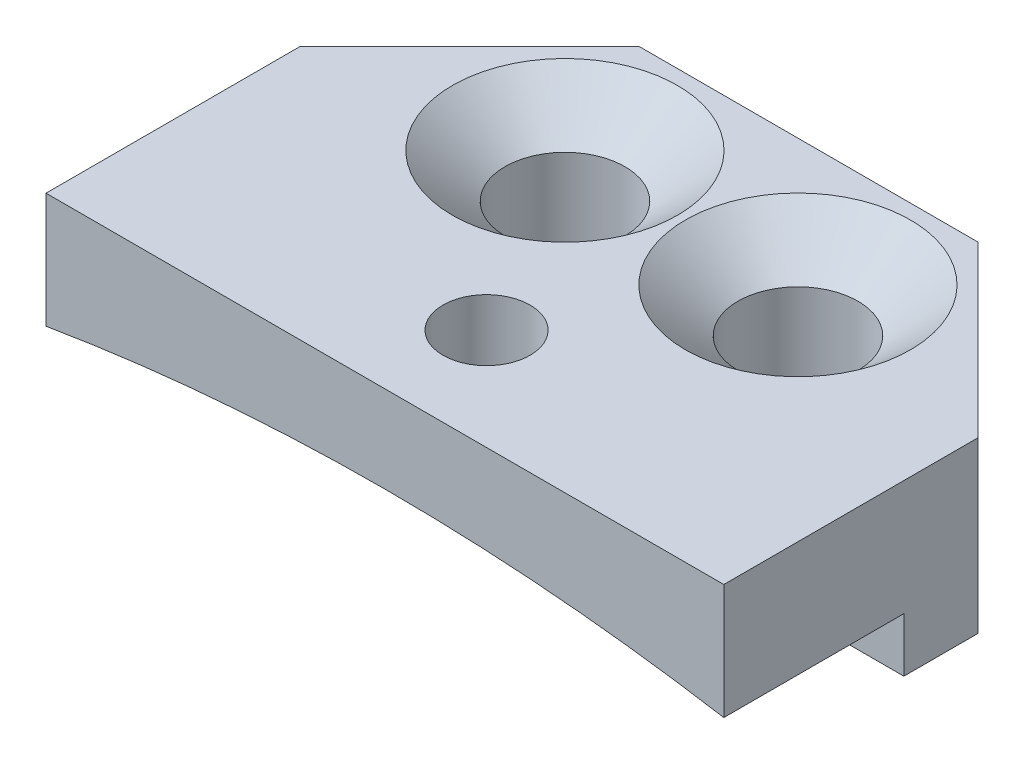
ISO-10303-21;
HEADER;
FILE_DESCRIPTION(('STEP AP214'),'2;1');
FILE_NAME('part.step','',(''),(''),'','','');
FILE_SCHEMA(('AUTOMOTIVE_DESIGN { 1 0 10303 214 1 1 1 1 }'));
ENDSEC;
DATA;
#1=APPLICATION_CONTEXT('core data for automotive mechanical design processes');
#2=APPLICATION_PROTOCOL_DEFINITION('international standard','automotive_design',2000,#1);
#3=PRODUCT_CONTEXT('',#1,'mechanical');
#4=PRODUCT('Part','Part','',(#3));
#5=PRODUCT_RELATED_PRODUCT_CATEGORY('part','',(#4));
#6=PRODUCT_DEFINITION_FORMATION('','',#4);
#7=PRODUCT_DEFINITION_CONTEXT('part definition',#1,'design');
#8=PRODUCT_DEFINITION('design','',#6,#7);
#9=PRODUCT_DEFINITION_SHAPE('','',#8);
#10=(LENGTH_UNIT() NAMED_UNIT(*) SI_UNIT(.MILLI.,.METRE.));
#11=(NAMED_UNIT(*) PLANE_ANGLE_UNIT() SI_UNIT($,.RADIAN.));
#12=(NAMED_UNIT(*) SI_UNIT($,.STERADIAN.) SOLID_ANGLE_UNIT());
#13=UNCERTAINTY_MEASURE_WITH_UNIT(LENGTH_MEASURE(1.E-05),#10,'distance_accuracy_value','');
#14=(GEOMETRIC_REPRESENTATION_CONTEXT(3) GLOBAL_UNCERTAINTY_ASSIGNED_CONTEXT((#13)) GLOBAL_UNIT_ASSIGNED_CONTEXT((#10,
#11,#12)) REPRESENTATION_CONTEXT('',''));
#15=CARTESIAN_POINT('',(0.,0.,0.));
#16=DIRECTION('',(0.,0.,1.));
#17=DIRECTION('',(1.,0.,0.));
#18=AXIS2_PLACEMENT_3D('',#15,#16,#17);
#19=CARTESIAN_POINT('',(-12.7,6.35,-7.9375));
#20=DIRECTION('',(1.,0.,0.));
#21=DIRECTION('',(0.,0.,-1.));
#22=AXIS2_PLACEMENT_3D('',#19,#20,#21);
#23=PLANE('',#22);
#24=DIRECTION('',(0.,-1.,0.));
#25=VECTOR('',#24,1.);
#26=CARTESIAN_POINT('',(-12.7,2.03069610250052,1.190625));
#27=LINE('',#26,#25);
#28=CARTESIAN_POINT('',(-12.7,2.03069610250052,1.190625));
#29=VERTEX_POINT('',#28);
#30=CARTESIAN_POINT('',(-12.7,0.,1.190625));
#31=VERTEX_POINT('',#30);
#32=EDGE_CURVE('E53',#29,#31,#27,.T.);
#33=ORIENTED_EDGE('',*,*,#32,.F.);
#34=DIRECTION('',(0.,0.,1.));
#35=VECTOR('',#34,1.);
#36=CARTESIAN_POINT('',(-12.7,2.03069610250052,1.190625));
#37=LINE('',#36,#35);
#38=CARTESIAN_POINT('',(-12.7,2.03069610250052,7.9375));
#39=VERTEX_POINT('',#38);
#40=EDGE_CURVE('E104',#29,#39,#37,.T.);
#41=ORIENTED_EDGE('',*,*,#40,.T.);
#42=DIRECTION('',(0.,-1.,0.));
#43=VECTOR('',#42,1.);
#44=CARTESIAN_POINT('',(-12.7,6.35,7.9375));
#45=LINE('',#44,#43);
#46=CARTESIAN_POINT('',(-12.7,6.35,7.9375));
#47=VERTEX_POINT('',#46);
#48=EDGE_CURVE('E149',#47,#39,#45,.T.);
#49=ORIENTED_EDGE('',*,*,#48,.F.);
#50=DIRECTION('',(0.,0.,1.));
#51=VECTOR('',#50,1.);
#52=CARTESIAN_POINT('',(-12.7,6.35,-7.9375));
#53=LINE('',#52,#51);
#54=CARTESIAN_POINT('',(-12.7,6.35,-1.5875));
#55=VERTEX_POINT('',#54);
#56=EDGE_CURVE('E131',#55,#47,#53,.T.);
#57=ORIENTED_EDGE('',*,*,#56,.F.);
#58=DIRECTION('',(0.,-1.,0.));
#59=VECTOR('',#58,1.);
#60=CARTESIAN_POINT('',(-12.7,6.35,-1.5875));
#61=LINE('',#60,#59);
#62=CARTESIAN_POINT('',(-12.7,0.,-1.5875));
#63=VERTEX_POINT('',#62);
#64=EDGE_CURVE('E11',#55,#63,#61,.T.);
#65=ORIENTED_EDGE('',*,*,#64,.T.);
#66=DIRECTION('',(0.,0.,1.));
#67=VECTOR('',#66,1.);
#68=CARTESIAN_POINT('',(-12.7,0.,-7.9375));
#69=LINE('',#68,#67);
#70=EDGE_CURVE('E122',#63,#31,#69,.T.);
#71=ORIENTED_EDGE('',*,*,#70,.T.);
#72=EDGE_LOOP('',(#33,#41,#49,#57,#65,#71));
#73=FACE_BOUND('',#72,.T.);
#74=ADVANCED_FACE('F33',(#73),#23,.F.);
#75=CARTESIAN_POINT('',(-12.7,6.35,7.9375));
#76=DIRECTION('',(0.,0.,-1.));
#77=DIRECTION('',(-1.,0.,0.));
#78=AXIS2_PLACEMENT_3D('',#75,#76,#77);
#79=PLANE('',#78);
#80=ORIENTED_EDGE('',*,*,#48,.T.);
#81=CARTESIAN_POINT('',(0.,-73.1035171428646,7.9375));
#82=DIRECTION('',(0.,0.,1.));
#83=DIRECTION('',(-1.,0.,0.));
#84=AXIS2_PLACEMENT_3D('',#81,#82,#83);
#85=CIRCLE('',#84,76.2);
#86=CARTESIAN_POINT('',(12.7,2.03069610250052,7.9375));
#87=VERTEX_POINT('',#86);
#88=EDGE_CURVE('E109',#87,#39,#85,.T.);
#89=ORIENTED_EDGE('',*,*,#88,.F.);
#90=DIRECTION('',(0.,-1.,0.));
#91=VECTOR('',#90,1.);
#92=CARTESIAN_POINT('',(12.7,6.35,7.9375));
#93=LINE('',#92,#91);
#94=CARTESIAN_POINT('',(12.7,6.35,7.9375));
#95=VERTEX_POINT('',#94);
#96=EDGE_CURVE('E141',#95,#87,#93,.T.);
#97=ORIENTED_EDGE('',*,*,#96,.F.);
#98=DIRECTION('',(1.,0.,0.));
#99=VECTOR('',#98,1.);
#100=CARTESIAN_POINT('',(-12.7,6.35,7.9375));
#101=LINE('',#100,#99);
#102=EDGE_CURVE('E133',#47,#95,#101,.T.);
#103=ORIENTED_EDGE('',*,*,#102,.F.);
#104=EDGE_LOOP('',(#80,#89,#97,#103));
#105=FACE_BOUND('',#104,.T.);
#106=ADVANCED_FACE('F185',(#105),#79,.F.);
#107=CARTESIAN_POINT('',(12.7,6.35,-7.9375));
#108=DIRECTION('',(-1.,0.,0.));
#109=DIRECTION('',(0.,0.,1.));
#110=AXIS2_PLACEMENT_3D('',#107,#108,#109);
#111=PLANE('',#110);
#112=ORIENTED_EDGE('',*,*,#96,.T.);
#113=DIRECTION('',(0.,0.,1.));
#114=VECTOR('',#113,1.);
#115=CARTESIAN_POINT('',(12.7,2.03069610250052,1.190625));
#116=LINE('',#115,#114);
#117=CARTESIAN_POINT('',(12.7,2.03069610250052,1.190625));
#118=VERTEX_POINT('',#117);
#119=EDGE_CURVE('E113',#118,#87,#116,.T.);
#120=ORIENTED_EDGE('',*,*,#119,.F.);
#121=DIRECTION('',(0.,1.,0.));
#122=VECTOR('',#121,1.);
#123=CARTESIAN_POINT('',(12.7,0.,1.190625));
#124=LINE('',#123,#122);
#125=CARTESIAN_POINT('',(12.7,0.,1.190625));
#126=VERTEX_POINT('',#125);
#127=EDGE_CURVE('E114',#126,#118,#124,.T.);
#128=ORIENTED_EDGE('',*,*,#127,.F.);
#129=DIRECTION('',(0.,0.,-1.));
#130=VECTOR('',#129,1.);
#131=CARTESIAN_POINT('',(12.7,0.,-7.9375));
#132=LINE('',#131,#130);
#133=CARTESIAN_POINT('',(12.7,0.,-1.58749999999997));
#134=VERTEX_POINT('',#133);
#135=EDGE_CURVE('E143',#126,#134,#132,.T.);
#136=ORIENTED_EDGE('',*,*,#135,.T.);
#137=DIRECTION('',(0.,1.,0.));
#138=VECTOR('',#137,1.);
#139=CARTESIAN_POINT('',(12.7,6.35,-1.58749999999997));
#140=LINE('',#139,#138);
#141=CARTESIAN_POINT('',(12.7,6.35,-1.58749999999997));
#142=VERTEX_POINT('',#141);
#143=EDGE_CURVE('E161',#134,#142,#140,.T.);
#144=ORIENTED_EDGE('',*,*,#143,.T.);
#145=DIRECTION('',(0.,0.,-1.));
#146=VECTOR('',#145,1.);
#147=CARTESIAN_POINT('',(12.7,6.35,-7.9375));
#148=LINE('',#147,#146);
#149=EDGE_CURVE('E136',#95,#142,#148,.T.);
#150=ORIENTED_EDGE('',*,*,#149,.F.);
#151=EDGE_LOOP('',(#112,#120,#128,#136,#144,#150));
#152=FACE_BOUND('',#151,.T.);
#153=ADVANCED_FACE('F182',(#152),#111,.F.);
#154=CARTESIAN_POINT('',(-12.7,6.35,-7.9375));
#155=DIRECTION('',(0.,0.,1.));
#156=DIRECTION('',(1.,0.,0.));
#157=AXIS2_PLACEMENT_3D('',#154,#155,#156);
#158=PLANE('',#157);
#159=DIRECTION('',(-1.,0.,0.));
#160=VECTOR('',#159,1.);
#161=CARTESIAN_POINT('',(-12.7,6.35,-7.9375));
#162=LINE('',#161,#160);
#163=CARTESIAN_POINT('',(6.34999999999999,6.35,-7.9375));
#164=VERTEX_POINT('',#163);
#165=CARTESIAN_POINT('',(-6.34999999999998,6.35,-7.9375));
#166=VERTEX_POINT('',#165);
#167=EDGE_CURVE('E139',#164,#166,#162,.T.);
#168=ORIENTED_EDGE('',*,*,#167,.F.);
#169=DIRECTION('',(0.,-1.,0.));
#170=VECTOR('',#169,1.);
#171=CARTESIAN_POINT('',(6.34999999999999,6.35,-7.9375));
#172=LINE('',#171,#170);
#173=CARTESIAN_POINT('',(6.34999999999999,0.,-7.9375));
#174=VERTEX_POINT('',#173);
#175=EDGE_CURVE('E153',#164,#174,#172,.T.);
#176=ORIENTED_EDGE('',*,*,#175,.T.);
#177=DIRECTION('',(-1.,0.,0.));
#178=VECTOR('',#177,1.);
#179=CARTESIAN_POINT('',(-12.7,0.,-7.9375));
#180=LINE('',#179,#178);
#181=CARTESIAN_POINT('',(-6.34999999999998,0.,-7.9375));
#182=VERTEX_POINT('',#181);
#183=EDGE_CURVE('E134',#174,#182,#180,.T.);
#184=ORIENTED_EDGE('',*,*,#183,.T.);
#185=DIRECTION('',(0.,1.,0.));
#186=VECTOR('',#185,1.);
#187=CARTESIAN_POINT('',(-6.34999999999998,6.35,-7.9375));
#188=LINE('',#187,#186);
#189=EDGE_CURVE('E151',#182,#166,#188,.T.);
#190=ORIENTED_EDGE('',*,*,#189,.T.);
#191=EDGE_LOOP('',(#168,#176,#184,#190));
#192=FACE_BOUND('',#191,.T.);
#193=ADVANCED_FACE('F172',(#192),#158,.F.);
#194=CARTESIAN_POINT('',(0.,6.35,0.));
#195=DIRECTION('',(0.,1.,0.));
#196=DIRECTION('',(0.,0.,1.));
#197=AXIS2_PLACEMENT_3D('',#194,#195,#196);
#198=PLANE('',#197);
#199=CARTESIAN_POINT('',(-4.365625,6.35,-3.175));
#200=DIRECTION('',(0.,1.,0.));
#201=DIRECTION('',(0.,0.,1.));
#202=AXIS2_PLACEMENT_3D('',#199,#200,#201);
#203=CIRCLE('',#202,4.2164);
#204=CARTESIAN_POINT('',(-4.365625,6.35,1.0414));
#205=VERTEX_POINT('',#204);
#206=EDGE_CURVE('E305',#205,#205,#203,.T.);
#207=ORIENTED_EDGE('',*,*,#206,.F.);
#208=EDGE_LOOP('',(#207));
#209=FACE_BOUND('',#208,.T.);
#210=CARTESIAN_POINT('',(4.365625,6.35,-3.175));
#211=DIRECTION('',(0.,1.,0.));
#212=DIRECTION('',(0.,0.,1.));
#213=AXIS2_PLACEMENT_3D('',#210,#211,#212);
#214=CIRCLE('',#213,4.2164);
#215=CARTESIAN_POINT('',(4.365625,6.35,1.0414));
#216=VERTEX_POINT('',#215);
#217=EDGE_CURVE('E297',#216,#216,#214,.T.);
#218=ORIENTED_EDGE('',*,*,#217,.F.);
#219=EDGE_LOOP('',(#218));
#220=FACE_BOUND('',#219,.T.);
#221=CARTESIAN_POINT('',(-1.45845508918381E-12,6.35,4.12928027816568));
#222=DIRECTION('',(0.,1.,0.));
#223=DIRECTION('',(0.,0.,1.));
#224=AXIS2_PLACEMENT_3D('',#221,#222,#223);
#225=CIRCLE('',#224,1.63194999998511);
#226=CARTESIAN_POINT('',(-1.45845508918381E-12,6.35,5.76123027815079));
#227=VERTEX_POINT('',#226);
#228=EDGE_CURVE('E287',#227,#227,#225,.T.);
#229=ORIENTED_EDGE('',*,*,#228,.F.);
#230=EDGE_LOOP('',(#229));
#231=FACE_BOUND('',#230,.T.);
#232=ORIENTED_EDGE('',*,*,#149,.T.);
#233=DIRECTION('',(0.707106781186547,0.,0.707106781186548));
#234=VECTOR('',#233,1.);
#235=CARTESIAN_POINT('',(7.14375,6.35,-7.14374999999998));
#236=LINE('',#235,#234);
#237=EDGE_CURVE('E46',#142,#164,#236,.F.);
#238=ORIENTED_EDGE('',*,*,#237,.T.);
#239=ORIENTED_EDGE('',*,*,#167,.T.);
#240=DIRECTION('',(0.707106781186549,0.,-0.707106781186546));
#241=VECTOR('',#240,1.);
#242=CARTESIAN_POINT('',(-7.14374999999998,6.35,-7.14375000000001));
#243=LINE('',#242,#241);
#244=EDGE_CURVE('E61',#166,#55,#243,.F.);
#245=ORIENTED_EDGE('',*,*,#244,.T.);
#246=ORIENTED_EDGE('',*,*,#56,.T.);
#247=ORIENTED_EDGE('',*,*,#102,.T.);
#248=EDGE_LOOP('',(#232,#238,#239,#245,#246,#247));
#249=FACE_BOUND('',#248,.T.);
#250=ADVANCED_FACE('F166',(#209,#220,#231,#249),#198,.T.);
#251=CARTESIAN_POINT('',(0.,0.,0.));
#252=DIRECTION('',(0.,1.,0.));
#253=DIRECTION('',(0.,0.,1.));
#254=AXIS2_PLACEMENT_3D('',#251,#252,#253);
#255=PLANE('',#254);
#256=CARTESIAN_POINT('',(-4.365625,0.,-3.175));
#257=DIRECTION('',(0.,1.,0.));
#258=DIRECTION('',(0.,0.,1.));
#259=AXIS2_PLACEMENT_3D('',#256,#257,#258);
#260=CIRCLE('',#259,2.2479);
#261=CARTESIAN_POINT('',(-4.365625,0.,-0.927100000000001));
#262=VERTEX_POINT('',#261);
#263=EDGE_CURVE('E300',#262,#262,#260,.T.);
#264=ORIENTED_EDGE('',*,*,#263,.T.);
#265=EDGE_LOOP('',(#264));
#266=FACE_BOUND('',#265,.T.);
#267=CARTESIAN_POINT('',(4.365625,0.,-3.175));
#268=DIRECTION('',(0.,1.,0.));
#269=DIRECTION('',(0.,0.,1.));
#270=AXIS2_PLACEMENT_3D('',#267,#268,#269);
#271=CIRCLE('',#270,2.2479);
#272=CARTESIAN_POINT('',(4.365625,0.,-0.927100000000001));
#273=VERTEX_POINT('',#272);
#274=EDGE_CURVE('E289',#273,#273,#271,.T.);
#275=ORIENTED_EDGE('',*,*,#274,.T.);
#276=EDGE_LOOP('',(#275));
#277=FACE_BOUND('',#276,.T.);
#278=ORIENTED_EDGE('',*,*,#135,.F.);
#279=DIRECTION('',(1.,0.,0.));
#280=VECTOR('',#279,1.);
#281=CARTESIAN_POINT('',(-12.7,0.,1.190625));
#282=LINE('',#281,#280);
#283=EDGE_CURVE('E123',#31,#126,#282,.T.);
#284=ORIENTED_EDGE('',*,*,#283,.F.);
#285=ORIENTED_EDGE('',*,*,#70,.F.);
#286=DIRECTION('',(-0.707106781186549,0.,0.707106781186546));
#287=VECTOR('',#286,1.);
#288=CARTESIAN_POINT('',(-12.7,0.,-1.5875));
#289=LINE('',#288,#287);
#290=EDGE_CURVE('E156',#63,#182,#289,.F.);
#291=ORIENTED_EDGE('',*,*,#290,.T.);
#292=ORIENTED_EDGE('',*,*,#183,.F.);
#293=DIRECTION('',(-0.707106781186547,0.,-0.707106781186548));
#294=VECTOR('',#293,1.);
#295=CARTESIAN_POINT('',(6.34999999999999,0.,-7.9375));
#296=LINE('',#295,#294);
#297=EDGE_CURVE('E158',#174,#134,#296,.F.);
#298=ORIENTED_EDGE('',*,*,#297,.T.);
#299=EDGE_LOOP('',(#278,#284,#285,#291,#292,#298));
#300=FACE_BOUND('',#299,.T.);
#301=ADVANCED_FACE('F178',(#266,#277,#300),#255,.F.);
#302=CARTESIAN_POINT('',(6.34999999999999,6.35,-7.9375));
#303=DIRECTION('',(-0.707106781186548,0.,0.707106781186547));
#304=DIRECTION('',(0.,-1.,0.));
#305=AXIS2_PLACEMENT_3D('',#302,#303,#304);
#306=PLANE('',#305);
#307=ORIENTED_EDGE('',*,*,#237,.F.);
#308=ORIENTED_EDGE('',*,*,#143,.F.);
#309=ORIENTED_EDGE('',*,*,#297,.F.);
#310=ORIENTED_EDGE('',*,*,#175,.F.);
#311=EDGE_LOOP('',(#307,#308,#309,#310));
#312=FACE_BOUND('',#311,.T.);
#313=ADVANCED_FACE('F175',(#312),#306,.F.);
#314=CARTESIAN_POINT('',(-12.7,6.35,-1.5875));
#315=DIRECTION('',(0.707106781186546,0.,0.707106781186549));
#316=DIRECTION('',(0.,-1.,0.));
#317=AXIS2_PLACEMENT_3D('',#314,#315,#316);
#318=PLANE('',#317);
#319=ORIENTED_EDGE('',*,*,#244,.F.);
#320=ORIENTED_EDGE('',*,*,#189,.F.);
#321=ORIENTED_EDGE('',*,*,#290,.F.);
#322=ORIENTED_EDGE('',*,*,#64,.F.);
#323=EDGE_LOOP('',(#319,#320,#321,#322));
#324=FACE_BOUND('',#323,.T.);
#325=ADVANCED_FACE('F35',(#324),#318,.F.);
#326=CARTESIAN_POINT('',(0.,-73.1035171428646,1.190625));
#327=DIRECTION('',(0.,0.,1.));
#328=DIRECTION('',(1.,0.,0.));
#329=AXIS2_PLACEMENT_3D('',#326,#327,#328);
#330=CYLINDRICAL_SURFACE('',#329,76.2);
#331=CARTESIAN_POINT('',(-1.45845508918381E-12,3.09648285713539,5.76123027815079));
#332=CARTESIAN_POINT('',(0.0916560718760625,3.0964826212527,5.76122621705502));
#333=CARTESIAN_POINT('',(0.183378335509574,3.09631571151644,5.75348277144416));
#334=CARTESIAN_POINT('',(0.36429601043271,3.09566592106379,5.72270051827388));
#335=CARTESIAN_POINT('',(0.453488258185255,3.09518266151056,5.69964337168951));
#336=CARTESIAN_POINT('',(0.626698727302549,3.09395490782087,5.63889109554065));
#337=CARTESIAN_POINT('',(0.710719427750643,3.09321054001647,5.60120304391026));
#338=CARTESIAN_POINT('',(0.871217731000541,3.09154456863522,5.51226872564322));
#339=CARTESIAN_POINT('',(0.947697185614447,3.09062300873407,5.4610257989513));
#340=CARTESIAN_POINT('',(1.09098892506416,3.08870613398489,5.3464172874719));
#341=CARTESIAN_POINT('',(1.15779880918722,3.08771080091325,5.28304870122322));
#342=CARTESIAN_POINT('',(1.2798349843189,3.0857587237207,5.14599214724925));
#343=CARTESIAN_POINT('',(1.33506081716483,3.0848019811273,5.07230377155648));
#344=CARTESIAN_POINT('',(1.43236218689421,3.08303492231967,4.91669404929379));
#345=CARTESIAN_POINT('',(1.47443670451439,3.08222461745682,4.8347720652464));
#346=CARTESIAN_POINT('',(1.54423429175574,3.08084192183114,4.66502522356817));
#347=CARTESIAN_POINT('',(1.57195740485299,3.08026953034758,4.57720038382031));
#348=CARTESIAN_POINT('',(1.61226122119566,3.07942730243276,4.39815508844711));
#349=CARTESIAN_POINT('',(1.62484424953912,3.07915741954499,4.30693515643282));
#350=CARTESIAN_POINT('',(1.63451785694038,3.07895049815825,4.12367733575581));
#351=CARTESIAN_POINT('',(1.63160848120144,3.07901345868813,4.03163944948048));
#352=CARTESIAN_POINT('',(1.61038187813256,3.07946508086334,3.84937412965198));
#353=CARTESIAN_POINT('',(1.5920671757049,3.07985368913562,3.75914640189846));
#354=CARTESIAN_POINT('',(1.54055370420173,3.08091271292653,3.58304652484292));
#355=CARTESIAN_POINT('',(1.50735491071379,3.08158312890738,3.49717438268507));
#356=CARTESIAN_POINT('',(1.42701276044862,3.08313024997841,3.3322152320564));
#357=CARTESIAN_POINT('',(1.37986824552161,3.08400697220046,3.25312878782117));
#358=CARTESIAN_POINT('',(1.27297380282234,3.08586784930659,3.10399224111826));
#359=CARTESIAN_POINT('',(1.21322386286893,3.08685200429448,3.03394214738289));
#360=CARTESIAN_POINT('',(1.08280035551403,3.08881703546746,2.90485204167673));
#361=CARTESIAN_POINT('',(1.01212459503144,3.0897979109538,2.84581424540645));
#362=CARTESIAN_POINT('',(0.861863437998916,3.09164561202882,2.74044167599766));
#363=CARTESIAN_POINT('',(0.782278040154495,3.09251243760093,2.69410690470477));
#364=CARTESIAN_POINT('',(0.616455569661828,3.09403432353906,2.61545594078182));
#365=CARTESIAN_POINT('',(0.530218465098106,3.09468938288893,2.58313981541938));
#366=CARTESIAN_POINT('',(0.353541120281993,3.09571387216272,2.53344489678947));
#367=CARTESIAN_POINT('',(0.263100885952553,3.09608330248913,2.51606608247337));
#368=CARTESIAN_POINT('',(0.0806038348130443,3.09649483604636,2.49674182230609));
#369=CARTESIAN_POINT('',(-0.0114526572970583,3.09653700428552,2.49479331133083));
#370=CARTESIAN_POINT('',(-0.194585945586097,3.09628943201534,2.50637698530969));
#371=CARTESIAN_POINT('',(-0.285662742321574,3.09599969169456,2.51990916146915));
#372=CARTESIAN_POINT('',(-0.464242733055772,3.09512100411534,2.56206753985746));
#373=CARTESIAN_POINT('',(-0.551746255166389,3.09453208439575,2.5906923528489));
#374=CARTESIAN_POINT('',(-0.720705817470201,3.09312141696555,2.66222202792288));
#375=CARTESIAN_POINT('',(-0.802161851845785,3.09229966903096,2.70512690374245));
#376=CARTESIAN_POINT('',(-0.956728287830927,3.09051579081715,2.80400667836789));
#377=CARTESIAN_POINT('',(-1.02983736861401,3.08955363837496,2.85998364145177));
#378=CARTESIAN_POINT('',(-1.16562132458625,3.08759747954013,2.98341556700449));
#379=CARTESIAN_POINT('',(-1.2282961841346,3.08660347309973,3.05087054667846));
#380=CARTESIAN_POINT('',(-1.34144276833928,3.08469548353016,3.19535680509315));
#381=CARTESIAN_POINT('',(-1.39191251488825,3.08378151338794,3.27238963307592));
#382=CARTESIAN_POINT('',(-1.47920265798188,3.08213684561548,3.43383691475812));
#383=CARTESIAN_POINT('',(-1.51602307728042,3.08140614767973,3.51825135615184));
#384=CARTESIAN_POINT('',(-1.57496591915508,3.08021049919867,3.69205816449949));
#385=CARTESIAN_POINT('',(-1.59708962824334,3.07974552539306,3.78145009499418));
#386=CARTESIAN_POINT('',(-1.62601526472484,3.07913368288063,3.96268062282763));
#387=CARTESIAN_POINT('',(-1.63281718542966,3.07898681431267,4.05451922123441));
#388=CARTESIAN_POINT('',(-1.63090598341704,3.07902775000515,4.23801613890165));
#389=CARTESIAN_POINT('',(-1.62219599251807,3.07921548670957,4.32967449081317));
#390=CARTESIAN_POINT('',(-1.58951462455753,3.07990432657077,4.51022772236743));
#391=CARTESIAN_POINT('',(-1.56554321700927,3.08040543035355,4.59912259648938));
#392=CARTESIAN_POINT('',(-1.50301963120215,3.08166450798995,4.77162735756379));
#393=CARTESIAN_POINT('',(-1.46446719129029,3.0824224864531,4.85523714964533));
#394=CARTESIAN_POINT('',(-1.37387779498907,3.08410982568216,5.01479507839052));
#395=CARTESIAN_POINT('',(-1.32184134673178,3.08503917998956,5.09074350361571));
#396=CARTESIAN_POINT('',(-1.20575493588486,3.08696464986429,5.23283527105796));
#397=CARTESIAN_POINT('',(-1.14170382653183,3.08796077179856,5.29897767623998));
#398=CARTESIAN_POINT('',(-1.00338779476827,3.08990767870564,5.41958799103788));
#399=CARTESIAN_POINT('',(-0.929120342564138,3.09085845237043,5.4740530004975));
#400=CARTESIAN_POINT('',(-0.772458692976272,3.09260771643433,5.56976732874257));
#401=CARTESIAN_POINT('',(-0.690059934036882,3.09340612061092,5.61100917375438));
#402=CARTESIAN_POINT('',(-0.519570326928556,3.09475897574508,5.6790259207298));
#403=CARTESIAN_POINT('',(-0.431486426086418,3.09531371822143,5.70581811916166));
#404=CARTESIAN_POINT('',(-0.285703060249685,3.09596805825761,5.73705497116268));
#405=CARTESIAN_POINT('',(-0.228950352960887,3.0961602731551,5.74610934976791));
#406=CARTESIAN_POINT('',(-0.114807088714333,3.09641774646711,5.75819827482069));
#407=CARTESIAN_POINT('',(-0.0574165318512346,3.09648300490046,5.76123282216157));
#408=CARTESIAN_POINT('',(-1.45845508918381E-12,3.09648285713539,5.76123027815079));
#409=B_SPLINE_CURVE_WITH_KNOTS('',3,(#331,#332,#333,#334,#335,#336,#337,#338,#339,#340,#341,
#342,#343,#344,#345,#346,#347,#348,#349,#350,#351,#352,#353,#354,#355,#356,#357,#358,#359,#360,
#361,#362,#363,#364,#365,#366,#367,#368,#369,#370,#371,#372,#373,#374,#375,#376,#377,#378,#379,
#380,#381,#382,#383,#384,#385,#386,#387,#388,#389,#390,#391,#392,#393,#394,#395,#396,#397,#398,
#399,#400,#401,#402,#403,#404,#405,#406,#407,#408),.UNSPECIFIED.,.T.,.F.,(4,2,2,2,2,2,2,2,2,2,2,
2,2,2,2,2,2,2,2,2,2,2,2,2,2,2,2,2,2,2,2,2,2,2,2,2,2,2,4),(0.,0.274758641577799,
0.549846916928713,0.824802279432857,1.09968995546509,1.3746457625948,1.64961244249599,
1.92460042779355,2.19958758003911,2.47453249647551,2.74947661068628,3.02437567088436,
3.29927518196539,3.57419752902789,3.84912014176059,4.12409801005249,4.39907591829604,
4.67405514598992,4.94903398620132,5.22395820237854,5.49888226236969,5.77378102074297,
6.04868004356215,6.32362250643732,6.59856538144528,6.87355278718204,7.14853973450338,
7.42350260700259,7.698465599531,7.97337308397099,8.2482811175767,8.52319408457294,
8.79809669324109,9.07302555390292,9.34802261602198,9.6231748344569,9.89799695593086,
10.0701152925893,10.2422336037061),.UNSPECIFIED.);
#410=CARTESIAN_POINT('',(-1.45845508918381E-12,3.09648285713539,5.76123027815079));
#411=VERTEX_POINT('',#410);
#412=EDGE_CURVE('E37',#411,#411,#409,.T.);
#413=ORIENTED_EDGE('',*,*,#412,.T.);
#414=EDGE_LOOP('',(#413));
#415=FACE_BOUND('',#414,.T.);
#416=ORIENTED_EDGE('',*,*,#88,.T.);
#417=ORIENTED_EDGE('',*,*,#40,.F.);
#418=CARTESIAN_POINT('',(0.,-73.1035171428646,1.190625));
#419=DIRECTION('',(0.,0.,1.));
#420=DIRECTION('',(-1.,0.,0.));
#421=AXIS2_PLACEMENT_3D('',#418,#419,#420);
#422=CIRCLE('',#421,76.2);
#423=EDGE_CURVE('E106',#118,#29,#422,.T.);
#424=ORIENTED_EDGE('',*,*,#423,.F.);
#425=ORIENTED_EDGE('',*,*,#119,.T.);
#426=EDGE_LOOP('',(#416,#417,#424,#425));
#427=FACE_BOUND('',#426,.T.);
#428=ADVANCED_FACE('F105',(#415,#427),#330,.F.);
#429=CARTESIAN_POINT('',(0.,-73.1035171428646,1.190625));
#430=DIRECTION('',(0.,0.,-1.));
#431=DIRECTION('',(-1.,0.,0.));
#432=AXIS2_PLACEMENT_3D('',#429,#430,#431);
#433=PLANE('',#432);
#434=ORIENTED_EDGE('',*,*,#423,.T.);
#435=ORIENTED_EDGE('',*,*,#32,.T.);
#436=ORIENTED_EDGE('',*,*,#283,.T.);
#437=ORIENTED_EDGE('',*,*,#127,.T.);
#438=EDGE_LOOP('',(#434,#435,#436,#437));
#439=FACE_BOUND('',#438,.T.);
#440=ADVANCED_FACE('F116',(#439),#433,.F.);
#441=CARTESIAN_POINT('',(-1.45845508918381E-12,0.,4.12928027816568));
#442=DIRECTION('',(0.,1.,0.));
#443=DIRECTION('',(0.,0.,1.));
#444=AXIS2_PLACEMENT_3D('',#441,#442,#443);
#445=CYLINDRICAL_SURFACE('',#444,1.63194999998511);
#446=ORIENTED_EDGE('',*,*,#228,.T.);
#447=EDGE_LOOP('',(#446));
#448=FACE_BOUND('',#447,.T.);
#449=ORIENTED_EDGE('',*,*,#412,.F.);
#450=EDGE_LOOP('',(#449));
#451=FACE_BOUND('',#450,.T.);
#452=ADVANCED_FACE('F225',(#448,#451),#445,.F.);
#453=CARTESIAN_POINT('',(4.365625,6.35,-3.175));
#454=DIRECTION('',(0.,1.,0.));
#455=DIRECTION('',(0.,0.,1.));
#456=AXIS2_PLACEMENT_3D('',#453,#454,#455);
#457=CYLINDRICAL_SURFACE('',#456,2.2479);
#458=ORIENTED_EDGE('',*,*,#274,.F.);
#459=EDGE_LOOP('',(#458));
#460=FACE_BOUND('',#459,.T.);
#461=CARTESIAN_POINT('',(4.365625,4.69823237602752,-3.175));
#462=DIRECTION('',(0.,1.,0.));
#463=DIRECTION('',(0.,0.,1.));
#464=AXIS2_PLACEMENT_3D('',#461,#462,#463);
#465=CIRCLE('',#464,2.2479);
#466=CARTESIAN_POINT('',(4.365625,4.69823237602752,-0.927100000000001));
#467=VERTEX_POINT('',#466);
#468=EDGE_CURVE('E292',#467,#467,#465,.T.);
#469=ORIENTED_EDGE('',*,*,#468,.T.);
#470=EDGE_LOOP('',(#469));
#471=FACE_BOUND('',#470,.T.);
#472=ADVANCED_FACE('F235',(#460,#471),#457,.F.);
#473=CARTESIAN_POINT('',(4.365625,6.35,-3.175));
#474=DIRECTION('',(0.,1.,0.));
#475=DIRECTION('',(0.,0.,1.));
#476=AXIS2_PLACEMENT_3D('',#473,#474,#475);
#477=CONICAL_SURFACE('',#476,4.2164,0.872664625997165);
#478=ORIENTED_EDGE('',*,*,#468,.F.);
#479=EDGE_LOOP('',(#478));
#480=FACE_BOUND('',#479,.T.);
#481=ORIENTED_EDGE('',*,*,#217,.T.);
#482=EDGE_LOOP('',(#481));
#483=FACE_BOUND('',#482,.T.);
#484=ADVANCED_FACE('F240',(#480,#483),#477,.F.);
#485=CARTESIAN_POINT('',(-4.365625,6.35,-3.175));
#486=DIRECTION('',(0.,1.,0.));
#487=DIRECTION('',(0.,0.,1.));
#488=AXIS2_PLACEMENT_3D('',#485,#486,#487);
#489=CYLINDRICAL_SURFACE('',#488,2.2479);
#490=ORIENTED_EDGE('',*,*,#263,.F.);
#491=EDGE_LOOP('',(#490));
#492=FACE_BOUND('',#491,.T.);
#493=CARTESIAN_POINT('',(-4.365625,4.69823237602752,-3.175));
#494=DIRECTION('',(0.,1.,0.));
#495=DIRECTION('',(0.,0.,1.));
#496=AXIS2_PLACEMENT_3D('',#493,#494,#495);
#497=CIRCLE('',#496,2.2479);
#498=CARTESIAN_POINT('',(-4.365625,4.69823237602752,-0.927100000000001));
#499=VERTEX_POINT('',#498);
#500=EDGE_CURVE('E302',#499,#499,#497,.T.);
#501=ORIENTED_EDGE('',*,*,#500,.T.);
#502=EDGE_LOOP('',(#501));
#503=FACE_BOUND('',#502,.T.);
#504=ADVANCED_FACE('F250',(#492,#503),#489,.F.);
#505=CARTESIAN_POINT('',(-4.365625,6.35,-3.175));
#506=DIRECTION('',(0.,1.,0.));
#507=DIRECTION('',(0.,0.,1.));
#508=AXIS2_PLACEMENT_3D('',#505,#506,#507);
#509=CONICAL_SURFACE('',#508,4.2164,0.872664625997165);
#510=ORIENTED_EDGE('',*,*,#500,.F.);
#511=EDGE_LOOP('',(#510));
#512=FACE_BOUND('',#511,.T.);
#513=ORIENTED_EDGE('',*,*,#206,.T.);
#514=EDGE_LOOP('',(#513));
#515=FACE_BOUND('',#514,.T.);
#516=ADVANCED_FACE('F260',(#512,#515),#509,.F.);
#517=CLOSED_SHELL('',(#74,#106,#153,#193,#250,#301,#313,#325,#428,#440,#452,#472,#484,#504,#516));
#518=MANIFOLD_SOLID_BREP('B2',#517);
#519=ADVANCED_BREP_SHAPE_REPRESENTATION('',(#18,#518),#14);
#520=SHAPE_DEFINITION_REPRESENTATION(#9,#519);
ENDSEC;
END-ISO-10303-21;
